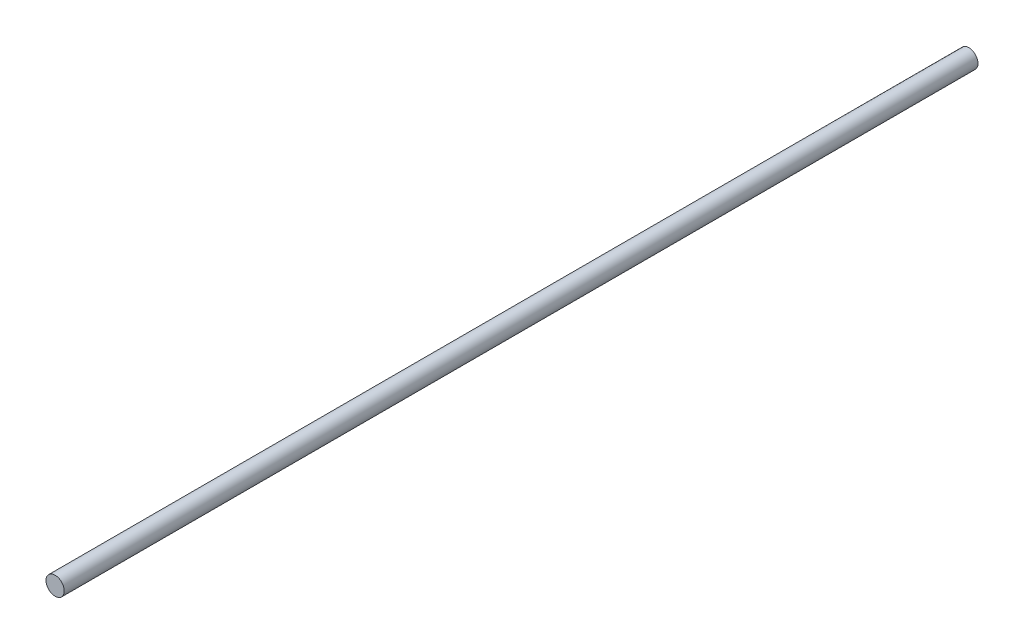
ISO-10303-21;
HEADER;
FILE_DESCRIPTION(('STEP AP214'),'2;1');
FILE_NAME('part.step','',(''),(''),'','','');
FILE_SCHEMA(('AUTOMOTIVE_DESIGN { 1 0 10303 214 1 1 1 1 }'));
ENDSEC;
DATA;
#1=APPLICATION_CONTEXT('core data for automotive mechanical design processes');
#2=APPLICATION_PROTOCOL_DEFINITION('international standard','automotive_design',2000,#1);
#3=PRODUCT_CONTEXT('',#1,'mechanical');
#4=PRODUCT('Part','Part','',(#3));
#5=PRODUCT_RELATED_PRODUCT_CATEGORY('part','',(#4));
#6=PRODUCT_DEFINITION_FORMATION('','',#4);
#7=PRODUCT_DEFINITION_CONTEXT('part definition',#1,'design');
#8=PRODUCT_DEFINITION('design','',#6,#7);
#9=PRODUCT_DEFINITION_SHAPE('','',#8);
#10=(LENGTH_UNIT() NAMED_UNIT(*) SI_UNIT(.MILLI.,.METRE.));
#11=(NAMED_UNIT(*) PLANE_ANGLE_UNIT() SI_UNIT($,.RADIAN.));
#12=(NAMED_UNIT(*) SI_UNIT($,.STERADIAN.) SOLID_ANGLE_UNIT());
#13=UNCERTAINTY_MEASURE_WITH_UNIT(LENGTH_MEASURE(1.E-05),#10,'distance_accuracy_value','');
#14=(GEOMETRIC_REPRESENTATION_CONTEXT(3) GLOBAL_UNCERTAINTY_ASSIGNED_CONTEXT((#13)) GLOBAL_UNIT_ASSIGNED_CONTEXT((#10,
#11,#12)) REPRESENTATION_CONTEXT('',''));
#15=CARTESIAN_POINT('',(0.,0.,0.));
#16=DIRECTION('',(0.,0.,1.));
#17=DIRECTION('',(1.,0.,0.));
#18=AXIS2_PLACEMENT_3D('',#15,#16,#17);
#19=CARTESIAN_POINT('',(0.,0.,1000.));
#20=DIRECTION('',(0.,0.,-1.));
#21=DIRECTION('',(-1.,0.,0.));
#22=AXIS2_PLACEMENT_3D('',#19,#20,#21);
#23=CYLINDRICAL_SURFACE('',#22,10.);
#24=CARTESIAN_POINT('',(0.,0.,1000.));
#25=DIRECTION('',(0.,0.,1.));
#26=DIRECTION('',(1.,0.,0.));
#27=AXIS2_PLACEMENT_3D('',#24,#25,#26);
#28=CIRCLE('',#27,10.);
#29=CARTESIAN_POINT('',(10.,0.,1000.));
#30=VERTEX_POINT('',#29);
#31=EDGE_CURVE('E10',#30,#30,#28,.T.);
#32=ORIENTED_EDGE('',*,*,#31,.F.);
#33=EDGE_LOOP('',(#32));
#34=FACE_BOUND('',#33,.T.);
#35=CARTESIAN_POINT('',(0.,0.,0.));
#36=DIRECTION('',(0.,0.,1.));
#37=DIRECTION('',(1.,0.,0.));
#38=AXIS2_PLACEMENT_3D('',#35,#36,#37);
#39=CIRCLE('',#38,10.);
#40=CARTESIAN_POINT('',(10.,0.,0.));
#41=VERTEX_POINT('',#40);
#42=EDGE_CURVE('E37',#41,#41,#39,.T.);
#43=ORIENTED_EDGE('',*,*,#42,.T.);
#44=EDGE_LOOP('',(#43));
#45=FACE_BOUND('',#44,.T.);
#46=ADVANCED_FACE('F34',(#34,#45),#23,.T.);
#47=CARTESIAN_POINT('',(0.,0.,1000.));
#48=DIRECTION('',(0.,0.,1.));
#49=DIRECTION('',(1.,0.,0.));
#50=AXIS2_PLACEMENT_3D('',#47,#48,#49);
#51=PLANE('',#50);
#52=ORIENTED_EDGE('',*,*,#31,.T.);
#53=EDGE_LOOP('',(#52));
#54=FACE_BOUND('',#53,.T.);
#55=ADVANCED_FACE('F49',(#54),#51,.T.);
#56=CARTESIAN_POINT('',(0.,0.,0.));
#57=DIRECTION('',(0.,0.,1.));
#58=DIRECTION('',(1.,0.,0.));
#59=AXIS2_PLACEMENT_3D('',#56,#57,#58);
#60=PLANE('',#59);
#61=ORIENTED_EDGE('',*,*,#42,.F.);
#62=EDGE_LOOP('',(#61));
#63=FACE_BOUND('',#62,.T.);
#64=ADVANCED_FACE('F47',(#63),#60,.F.);
#65=CLOSED_SHELL('',(#46,#55,#64));
#66=MANIFOLD_SOLID_BREP('B2',#65);
#67=ADVANCED_BREP_SHAPE_REPRESENTATION('',(#18,#66),#14);
#68=SHAPE_DEFINITION_REPRESENTATION(#9,#67);
ENDSEC;
END-ISO-10303-21;
